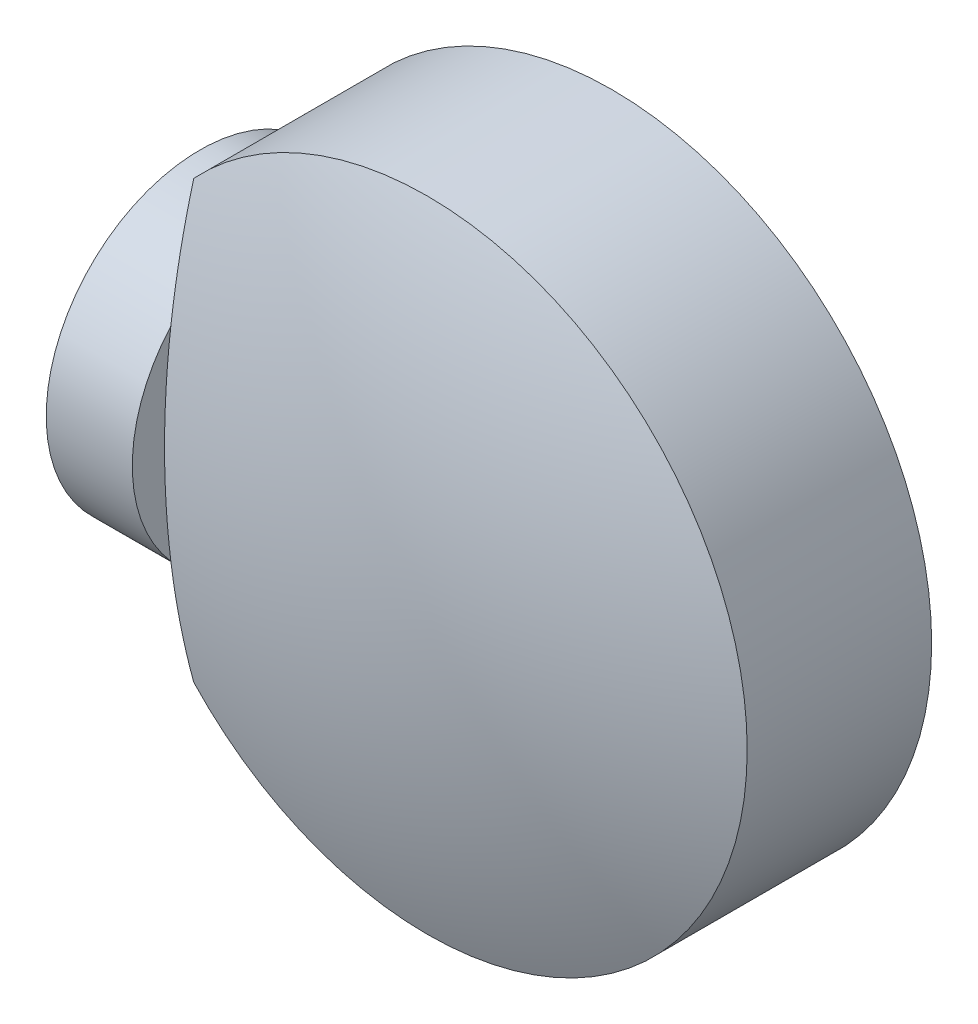
ISO-10303-21;
HEADER;
FILE_DESCRIPTION(('STEP AP214'),'2;1');
FILE_NAME('part.step','',(''),(''),'','','');
FILE_SCHEMA(('AUTOMOTIVE_DESIGN { 1 0 10303 214 1 1 1 1 }'));
ENDSEC;
DATA;
#1=APPLICATION_CONTEXT('core data for automotive mechanical design processes');
#2=APPLICATION_PROTOCOL_DEFINITION('international standard','automotive_design',2000,#1);
#3=PRODUCT_CONTEXT('',#1,'mechanical');
#4=PRODUCT('Part','Part','',(#3));
#5=PRODUCT_RELATED_PRODUCT_CATEGORY('part','',(#4));
#6=PRODUCT_DEFINITION_FORMATION('','',#4);
#7=PRODUCT_DEFINITION_CONTEXT('part definition',#1,'design');
#8=PRODUCT_DEFINITION('design','',#6,#7);
#9=PRODUCT_DEFINITION_SHAPE('','',#8);
#10=(LENGTH_UNIT() NAMED_UNIT(*) SI_UNIT(.MILLI.,.METRE.));
#11=(NAMED_UNIT(*) PLANE_ANGLE_UNIT() SI_UNIT($,.RADIAN.));
#12=(NAMED_UNIT(*) SI_UNIT($,.STERADIAN.) SOLID_ANGLE_UNIT());
#13=UNCERTAINTY_MEASURE_WITH_UNIT(LENGTH_MEASURE(1.E-05),#10,'distance_accuracy_value','');
#14=(GEOMETRIC_REPRESENTATION_CONTEXT(3) GLOBAL_UNCERTAINTY_ASSIGNED_CONTEXT((#13)) GLOBAL_UNIT_ASSIGNED_CONTEXT((#10,
#11,#12)) REPRESENTATION_CONTEXT('',''));
#15=CARTESIAN_POINT('',(0.,0.,0.));
#16=DIRECTION('',(0.,0.,1.));
#17=DIRECTION('',(1.,0.,0.));
#18=AXIS2_PLACEMENT_3D('',#15,#16,#17);
#19=CARTESIAN_POINT('',(-19.,32.0960089861266,-5.));
#20=DIRECTION('',(1.,0.,0.));
#21=DIRECTION('',(0.,1.,0.));
#22=AXIS2_PLACEMENT_3D('',#19,#20,#21);
#23=PLANE('',#22);
#24=CARTESIAN_POINT('',(-19.,-0.00176065070114735,7.5));
#25=DIRECTION('',(1.,0.,0.));
#26=DIRECTION('',(0.,1.,0.));
#27=AXIS2_PLACEMENT_3D('',#24,#25,#26);
#28=CIRCLE('',#27,12.5);
#29=CARTESIAN_POINT('',(-19.,-8.27985224972114,-1.86606638233119));
#30=VERTEX_POINT('',#29);
#31=CARTESIAN_POINT('',(-19.,-8.27985224972114,16.8660663823312));
#32=VERTEX_POINT('',#31);
#33=EDGE_CURVE('E11',#30,#32,#28,.F.);
#34=ORIENTED_EDGE('',*,*,#33,.F.);
#35=CARTESIAN_POINT('',(-19.,0.,65.1));
#36=DIRECTION('',(1.,0.,0.));
#37=DIRECTION('',(0.,1.,0.));
#38=AXIS2_PLACEMENT_3D('',#35,#36,#37);
#39=CIRCLE('',#38,67.4759957318156);
#40=CARTESIAN_POINT('',(-19.,-17.7482393492989,0.));
#41=VERTEX_POINT('',#40);
#42=EDGE_CURVE('E73',#41,#30,#39,.T.);
#43=ORIENTED_EDGE('',*,*,#42,.F.);
#44=DIRECTION('',(0.,0.,-1.));
#45=VECTOR('',#44,1.);
#46=CARTESIAN_POINT('',(-19.,-17.7482393492989,15.));
#47=LINE('',#46,#45);
#48=CARTESIAN_POINT('',(-19.,-17.7482393492989,15.));
#49=VERTEX_POINT('',#48);
#50=EDGE_CURVE('E99',#49,#41,#47,.T.);
#51=ORIENTED_EDGE('',*,*,#50,.F.);
#52=CARTESIAN_POINT('',(-19.,0.,-50.1));
#53=DIRECTION('',(1.,0.,0.));
#54=DIRECTION('',(0.,1.,0.));
#55=AXIS2_PLACEMENT_3D('',#52,#53,#54);
#56=CIRCLE('',#55,67.4759957318156);
#57=EDGE_CURVE('E93',#49,#32,#56,.F.);
#58=ORIENTED_EDGE('',*,*,#57,.T.);
#59=EDGE_LOOP('',(#34,#43,#51,#58));
#60=FACE_BOUND('',#59,.T.);
#61=ADVANCED_FACE('F30',(#60),#23,.F.);
#62=CARTESIAN_POINT('',(-19.,8.2757583505121,16.8665724352376));
#63=VERTEX_POINT('',#62);
#64=CARTESIAN_POINT('',(-19.,8.27575835051211,-1.86657243523764));
#65=VERTEX_POINT('',#64);
#66=EDGE_CURVE('E34',#63,#65,#28,.F.);
#67=ORIENTED_EDGE('',*,*,#66,.F.);
#68=CARTESIAN_POINT('',(-19.,17.7482393492988,15.));
#69=VERTEX_POINT('',#68);
#70=EDGE_CURVE('E98',#63,#69,#56,.F.);
#71=ORIENTED_EDGE('',*,*,#70,.T.);
#72=DIRECTION('',(0.,0.,-1.));
#73=VECTOR('',#72,1.);
#74=CARTESIAN_POINT('',(-19.,17.7482393492988,15.));
#75=LINE('',#74,#73);
#76=CARTESIAN_POINT('',(-19.,17.7482393492989,0.));
#77=VERTEX_POINT('',#76);
#78=EDGE_CURVE('E79',#77,#69,#75,.F.);
#79=ORIENTED_EDGE('',*,*,#78,.F.);
#80=EDGE_CURVE('E71',#65,#77,#39,.T.);
#81=ORIENTED_EDGE('',*,*,#80,.F.);
#82=EDGE_LOOP('',(#67,#71,#79,#81));
#83=FACE_BOUND('',#82,.T.);
#84=ADVANCED_FACE('F77',(#83),#23,.F.);
#85=CARTESIAN_POINT('',(0.,0.,15.));
#86=DIRECTION('',(0.,0.,-1.));
#87=DIRECTION('',(-1.,0.,0.));
#88=AXIS2_PLACEMENT_3D('',#85,#86,#87);
#89=CYLINDRICAL_SURFACE('',#88,26.);
#90=CARTESIAN_POINT('',(0.,0.,15.));
#91=DIRECTION('',(0.,0.,1.));
#92=DIRECTION('',(1.,0.,0.));
#93=AXIS2_PLACEMENT_3D('',#90,#91,#92);
#94=CIRCLE('',#93,26.);
#95=EDGE_CURVE('E81',#49,#69,#94,.T.);
#96=ORIENTED_EDGE('',*,*,#95,.F.);
#97=ORIENTED_EDGE('',*,*,#50,.T.);
#98=CARTESIAN_POINT('',(0.,0.,0.));
#99=DIRECTION('',(0.,0.,1.));
#100=DIRECTION('',(1.,0.,0.));
#101=AXIS2_PLACEMENT_3D('',#98,#99,#100);
#102=CIRCLE('',#101,26.);
#103=EDGE_CURVE('E91',#41,#77,#102,.T.);
#104=ORIENTED_EDGE('',*,*,#103,.T.);
#105=ORIENTED_EDGE('',*,*,#78,.T.);
#106=EDGE_LOOP('',(#96,#97,#104,#105));
#107=FACE_BOUND('',#106,.T.);
#108=ADVANCED_FACE('F123',(#107),#89,.T.);
#109=CARTESIAN_POINT('',(0.,0.,-50.1));
#110=DIRECTION('',(0.,0.,1.));
#111=DIRECTION('',(1.,0.,0.));
#112=AXIS2_PLACEMENT_3D('',#109,#110,#111);
#113=SPHERICAL_SURFACE('',#112,70.1);
#114=ORIENTED_EDGE('',*,*,#57,.F.);
#115=ORIENTED_EDGE('',*,*,#95,.T.);
#116=ORIENTED_EDGE('',*,*,#70,.F.);
#117=EDGE_CURVE('E97',#32,#63,#56,.F.);
#118=ORIENTED_EDGE('',*,*,#117,.F.);
#119=EDGE_LOOP('',(#114,#115,#116,#118));
#120=FACE_BOUND('',#119,.T.);
#121=ADVANCED_FACE('F126',(#120),#113,.T.);
#122=CARTESIAN_POINT('',(0.,0.,65.1));
#123=DIRECTION('',(0.,0.,1.));
#124=DIRECTION('',(1.,0.,0.));
#125=AXIS2_PLACEMENT_3D('',#122,#123,#124);
#126=SPHERICAL_SURFACE('',#125,70.1);
#127=ORIENTED_EDGE('',*,*,#103,.F.);
#128=ORIENTED_EDGE('',*,*,#42,.T.);
#129=EDGE_CURVE('E69',#30,#65,#39,.T.);
#130=ORIENTED_EDGE('',*,*,#129,.T.);
#131=ORIENTED_EDGE('',*,*,#80,.T.);
#132=EDGE_LOOP('',(#127,#128,#130,#131));
#133=FACE_BOUND('',#132,.T.);
#134=ADVANCED_FACE('F32',(#133),#126,.T.);
#135=CARTESIAN_POINT('',(-19.,-0.00176065070114735,7.5));
#136=DIRECTION('',(-1.,0.,0.));
#137=DIRECTION('',(0.,-1.,0.));
#138=AXIS2_PLACEMENT_3D('',#135,#136,#137);
#139=PLANE('',#138);
#140=CARTESIAN_POINT('',(-19.,-0.00176065070114735,7.5));
#141=DIRECTION('',(-1.,0.,0.));
#142=DIRECTION('',(0.,-1.,0.));
#143=AXIS2_PLACEMENT_3D('',#140,#141,#142);
#144=CIRCLE('',#143,12.5);
#145=EDGE_CURVE('E82',#65,#30,#144,.T.);
#146=ORIENTED_EDGE('',*,*,#145,.F.);
#147=ORIENTED_EDGE('',*,*,#129,.F.);
#148=EDGE_LOOP('',(#146,#147));
#149=FACE_BOUND('',#148,.T.);
#150=ADVANCED_FACE('F83',(#149),#139,.F.);
#151=CARTESIAN_POINT('',(-26.,-0.00176065070114813,7.5));
#152=DIRECTION('',(1.,0.,0.));
#153=DIRECTION('',(0.,1.,0.));
#154=AXIS2_PLACEMENT_3D('',#151,#152,#153);
#155=CYLINDRICAL_SURFACE('',#154,12.5);
#156=CARTESIAN_POINT('',(-26.,-0.00176065070114813,7.5));
#157=DIRECTION('',(-1.,0.,0.));
#158=DIRECTION('',(0.,-1.,0.));
#159=AXIS2_PLACEMENT_3D('',#156,#157,#158);
#160=CIRCLE('',#159,12.5);
#161=CARTESIAN_POINT('',(-26.,-12.5017606507012,7.5));
#162=VERTEX_POINT('',#161);
#163=EDGE_CURVE('E102',#162,#162,#160,.T.);
#164=ORIENTED_EDGE('',*,*,#163,.F.);
#165=EDGE_LOOP('',(#164));
#166=FACE_BOUND('',#165,.T.);
#167=EDGE_CURVE('E85',#32,#63,#144,.T.);
#168=ORIENTED_EDGE('',*,*,#167,.T.);
#169=ORIENTED_EDGE('',*,*,#66,.T.);
#170=ORIENTED_EDGE('',*,*,#145,.T.);
#171=ORIENTED_EDGE('',*,*,#33,.T.);
#172=EDGE_LOOP('',(#168,#169,#170,#171));
#173=FACE_BOUND('',#172,.T.);
#174=ADVANCED_FACE('F88',(#166,#173),#155,.T.);
#175=CARTESIAN_POINT('',(-26.,-0.00176065070114813,7.5));
#176=DIRECTION('',(-1.,0.,0.));
#177=DIRECTION('',(0.,-1.,0.));
#178=AXIS2_PLACEMENT_3D('',#175,#176,#177);
#179=PLANE('',#178);
#180=ORIENTED_EDGE('',*,*,#163,.T.);
#181=EDGE_LOOP('',(#180));
#182=FACE_BOUND('',#181,.T.);
#183=ADVANCED_FACE('F107',(#182),#179,.T.);
#184=ORIENTED_EDGE('',*,*,#117,.T.);
#185=ORIENTED_EDGE('',*,*,#167,.F.);
#186=EDGE_LOOP('',(#184,#185));
#187=FACE_BOUND('',#186,.T.);
#188=ADVANCED_FACE('F115',(#187),#139,.F.);
#189=CLOSED_SHELL('',(#61,#84,#108,#121,#134,#150,#174,#183,#188));
#190=MANIFOLD_SOLID_BREP('B2',#189);
#191=ADVANCED_BREP_SHAPE_REPRESENTATION('',(#18,#190),#14);
#192=SHAPE_DEFINITION_REPRESENTATION(#9,#191);
ENDSEC;
END-ISO-10303-21;
